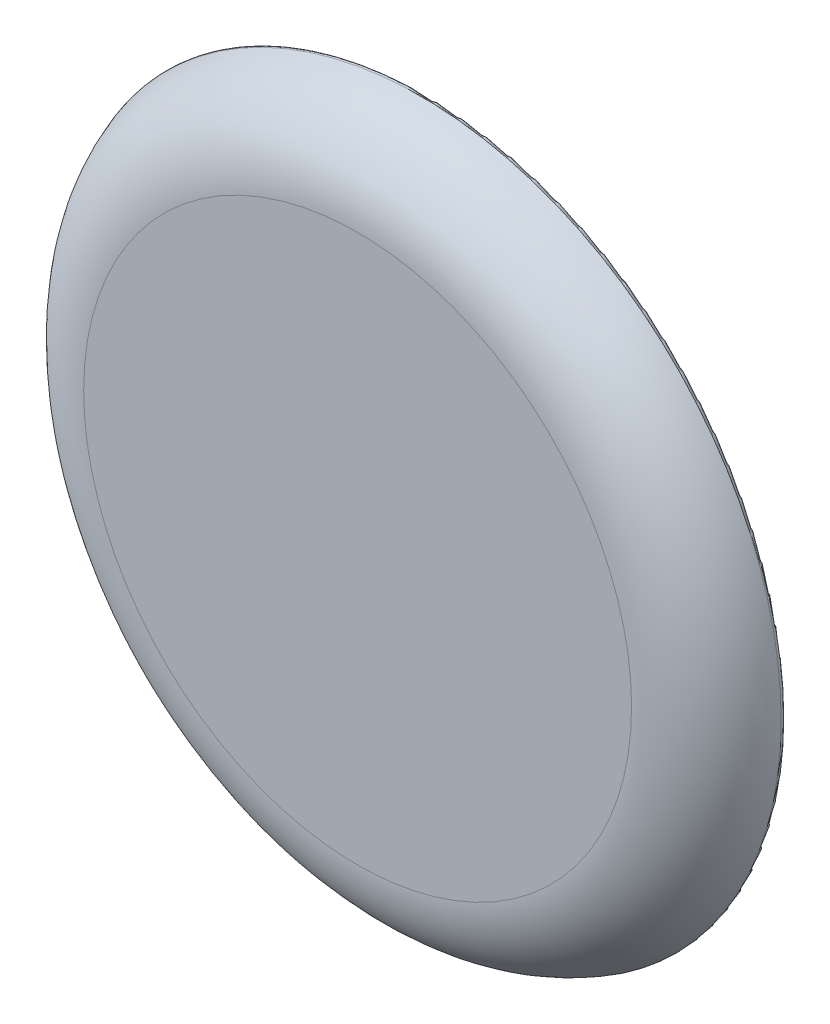
ISO-10303-21;
HEADER;
FILE_DESCRIPTION(('STEP AP214'),'2;1');
FILE_NAME('part.step','',(''),(''),'','','');
FILE_SCHEMA(('AUTOMOTIVE_DESIGN { 1 0 10303 214 1 1 1 1 }'));
ENDSEC;
DATA;
#1=APPLICATION_CONTEXT('core data for automotive mechanical design processes');
#2=APPLICATION_PROTOCOL_DEFINITION('international standard','automotive_design',2000,#1);
#3=PRODUCT_CONTEXT('',#1,'mechanical');
#4=PRODUCT('Part','Part','',(#3));
#5=PRODUCT_RELATED_PRODUCT_CATEGORY('part','',(#4));
#6=PRODUCT_DEFINITION_FORMATION('','',#4);
#7=PRODUCT_DEFINITION_CONTEXT('part definition',#1,'design');
#8=PRODUCT_DEFINITION('design','',#6,#7);
#9=PRODUCT_DEFINITION_SHAPE('','',#8);
#10=(LENGTH_UNIT() NAMED_UNIT(*) SI_UNIT(.MILLI.,.METRE.));
#11=(NAMED_UNIT(*) PLANE_ANGLE_UNIT() SI_UNIT($,.RADIAN.));
#12=(NAMED_UNIT(*) SI_UNIT($,.STERADIAN.) SOLID_ANGLE_UNIT());
#13=UNCERTAINTY_MEASURE_WITH_UNIT(LENGTH_MEASURE(1.E-05),#10,'distance_accuracy_value','');
#14=(GEOMETRIC_REPRESENTATION_CONTEXT(3) GLOBAL_UNCERTAINTY_ASSIGNED_CONTEXT((#13)) GLOBAL_UNIT_ASSIGNED_CONTEXT((#10,
#11,#12)) REPRESENTATION_CONTEXT('',''));
#15=CARTESIAN_POINT('',(0.,0.,0.));
#16=DIRECTION('',(0.,0.,1.));
#17=DIRECTION('',(1.,0.,0.));
#18=AXIS2_PLACEMENT_3D('',#15,#16,#17);
#19=CARTESIAN_POINT('',(-86.2646693199202,57.4705089523402,3.));
#20=DIRECTION('',(0.,0.,1.));
#21=DIRECTION('',(1.,0.,0.));
#22=AXIS2_PLACEMENT_3D('',#19,#20,#21);
#23=PLANE('',#22);
#24=CARTESIAN_POINT('',(-86.2646693199202,57.4705089523402,3.));
#25=DIRECTION('',(0.,0.,1.));
#26=DIRECTION('',(1.,0.,0.));
#27=AXIS2_PLACEMENT_3D('',#24,#25,#26);
#28=CIRCLE('',#27,12.1270166537926);
#29=CARTESIAN_POINT('',(-74.1376526661277,57.4705089523402,3.));
#30=VERTEX_POINT('',#29);
#31=EDGE_CURVE('E64',#30,#30,#28,.T.);
#32=ORIENTED_EDGE('',*,*,#31,.T.);
#33=EDGE_LOOP('',(#32));
#34=FACE_BOUND('',#33,.T.);
#35=ADVANCED_FACE('F41',(#34),#23,.T.);
#36=CARTESIAN_POINT('',(-86.2646693199202,57.4705089523402,0.));
#37=DIRECTION('',(0.,0.,1.));
#38=DIRECTION('',(1.,0.,0.));
#39=AXIS2_PLACEMENT_3D('',#36,#37,#38);
#40=PLANE('',#39);
#41=CARTESIAN_POINT('',(-86.2646693199202,57.4705089523402,0.));
#42=DIRECTION('',(0.,0.,1.));
#43=DIRECTION('',(1.,0.,0.));
#44=AXIS2_PLACEMENT_3D('',#41,#42,#43);
#45=CIRCLE('',#44,11.05);
#46=CARTESIAN_POINT('',(-75.2146693199202,57.4705089523402,0.));
#47=VERTEX_POINT('',#46);
#48=EDGE_CURVE('E52',#47,#47,#45,.F.);
#49=ORIENTED_EDGE('',*,*,#48,.F.);
#50=EDGE_LOOP('',(#49));
#51=FACE_BOUND('',#50,.T.);
#52=CARTESIAN_POINT('',(-86.2646693199202,57.4705089523402,0.));
#53=DIRECTION('',(0.,0.,1.));
#54=DIRECTION('',(1.,0.,0.));
#55=AXIS2_PLACEMENT_3D('',#52,#53,#54);
#56=CIRCLE('',#55,15.8012512679673);
#57=CARTESIAN_POINT('',(-70.4634180519529,57.4705089523402,0.));
#58=VERTEX_POINT('',#57);
#59=EDGE_CURVE('E56',#58,#58,#56,.F.);
#60=ORIENTED_EDGE('',*,*,#59,.T.);
#61=EDGE_LOOP('',(#60));
#62=FACE_BOUND('',#61,.T.);
#63=ADVANCED_FACE('F91',(#51,#62),#40,.F.);
#64=CARTESIAN_POINT('',(-86.2646693199202,57.4705089523402,-1.));
#65=DIRECTION('',(0.,0.,-1.));
#66=DIRECTION('',(-1.,0.,0.));
#67=AXIS2_PLACEMENT_3D('',#64,#65,#66);
#68=TOROIDAL_SURFACE('',#67,12.1270166537926,4.);
#69=CARTESIAN_POINT('',(-86.2646693199202,57.4705089523402,0.194805194805193));
#70=DIRECTION('',(0.,0.,-1.));
#71=DIRECTION('',(-1.,0.,0.));
#72=AXIS2_PLACEMENT_3D('',#69,#70,#71);
#73=CIRCLE('',#72,15.9444032659222);
#74=CARTESIAN_POINT('',(-102.209072585842,57.4705089523402,0.194805194805193));
#75=VERTEX_POINT('',#74);
#76=EDGE_CURVE('E61',#75,#75,#73,.F.);
#77=ORIENTED_EDGE('',*,*,#76,.T.);
#78=EDGE_LOOP('',(#77));
#79=FACE_BOUND('',#78,.T.);
#80=ORIENTED_EDGE('',*,*,#31,.F.);
#81=EDGE_LOOP('',(#80));
#82=FACE_BOUND('',#81,.T.);
#83=ADVANCED_FACE('F87',(#79,#82),#68,.T.);
#84=CARTESIAN_POINT('',(-86.2646693199202,57.4705089523402,0.15));
#85=DIRECTION('',(0.,0.,1.));
#86=DIRECTION('',(1.,0.,0.));
#87=AXIS2_PLACEMENT_3D('',#84,#85,#86);
#88=TOROIDAL_SURFACE('',#87,15.8012512679673,0.15);
#89=ORIENTED_EDGE('',*,*,#59,.F.);
#90=EDGE_LOOP('',(#89));
#91=FACE_BOUND('',#90,.T.);
#92=ORIENTED_EDGE('',*,*,#76,.F.);
#93=EDGE_LOOP('',(#92));
#94=FACE_BOUND('',#93,.T.);
#95=ADVANCED_FACE('F80',(#91,#94),#88,.T.);
#96=CARTESIAN_POINT('',(-86.2646693199202,57.4705089523402,-2.));
#97=DIRECTION('',(0.,0.,-1.));
#98=DIRECTION('',(-1.,0.,0.));
#99=AXIS2_PLACEMENT_3D('',#96,#97,#98);
#100=PLANE('',#99);
#101=CARTESIAN_POINT('',(-86.2646693199202,57.4705089523402,-2.));
#102=DIRECTION('',(0.,0.,-1.));
#103=DIRECTION('',(-1.,0.,0.));
#104=AXIS2_PLACEMENT_3D('',#101,#102,#103);
#105=CIRCLE('',#104,10.8);
#106=CARTESIAN_POINT('',(-97.0646693199203,57.4705089523402,-2.));
#107=VERTEX_POINT('',#106);
#108=EDGE_CURVE('E48',#107,#107,#105,.T.);
#109=ORIENTED_EDGE('',*,*,#108,.T.);
#110=EDGE_LOOP('',(#109));
#111=FACE_BOUND('',#110,.T.);
#112=CARTESIAN_POINT('',(-86.2646693199202,57.4705089523402,-2.));
#113=DIRECTION('',(0.,0.,-1.));
#114=DIRECTION('',(-1.,0.,0.));
#115=AXIS2_PLACEMENT_3D('',#112,#113,#114);
#116=CIRCLE('',#115,7.75000000000001);
#117=CARTESIAN_POINT('',(-94.0146693199203,57.4705089523402,-2.));
#118=VERTEX_POINT('',#117);
#119=EDGE_CURVE('E67',#118,#118,#116,.T.);
#120=ORIENTED_EDGE('',*,*,#119,.F.);
#121=EDGE_LOOP('',(#120));
#122=FACE_BOUND('',#121,.T.);
#123=ADVANCED_FACE('F77',(#111,#122),#100,.T.);
#124=CARTESIAN_POINT('',(-86.2646693199202,57.4705089523402,-2.));
#125=DIRECTION('',(0.,0.,1.));
#126=DIRECTION('',(1.,0.,0.));
#127=AXIS2_PLACEMENT_3D('',#124,#125,#126);
#128=CYLINDRICAL_SURFACE('',#127,11.05);
#129=CARTESIAN_POINT('',(-86.2646693199202,57.4705089523402,-1.75));
#130=DIRECTION('',(0.,0.,-1.));
#131=DIRECTION('',(-1.,0.,0.));
#132=AXIS2_PLACEMENT_3D('',#129,#130,#131);
#133=CIRCLE('',#132,11.05);
#134=CARTESIAN_POINT('',(-97.3146693199203,57.4705089523402,-1.75));
#135=VERTEX_POINT('',#134);
#136=EDGE_CURVE('E10',#135,#135,#133,.F.);
#137=ORIENTED_EDGE('',*,*,#136,.T.);
#138=EDGE_LOOP('',(#137));
#139=FACE_BOUND('',#138,.T.);
#140=ORIENTED_EDGE('',*,*,#48,.T.);
#141=EDGE_LOOP('',(#140));
#142=FACE_BOUND('',#141,.T.);
#143=ADVANCED_FACE('F79',(#139,#142),#128,.T.);
#144=CARTESIAN_POINT('',(-86.2646693199202,57.4705089523402,-2.));
#145=DIRECTION('',(0.,0.,1.));
#146=DIRECTION('',(1.,0.,0.));
#147=AXIS2_PLACEMENT_3D('',#144,#145,#146);
#148=CYLINDRICAL_SURFACE('',#147,7.75000000000001);
#149=ORIENTED_EDGE('',*,*,#119,.T.);
#150=EDGE_LOOP('',(#149));
#151=FACE_BOUND('',#150,.T.);
#152=CARTESIAN_POINT('',(-86.2646693199202,57.4705089523402,0.));
#153=DIRECTION('',(0.,0.,-1.));
#154=DIRECTION('',(-1.,0.,0.));
#155=AXIS2_PLACEMENT_3D('',#152,#153,#154);
#156=CIRCLE('',#155,7.75000000000001);
#157=CARTESIAN_POINT('',(-94.0146693199203,57.4705089523402,0.));
#158=VERTEX_POINT('',#157);
#159=EDGE_CURVE('E68',#158,#158,#156,.T.);
#160=ORIENTED_EDGE('',*,*,#159,.F.);
#161=EDGE_LOOP('',(#160));
#162=FACE_BOUND('',#161,.T.);
#163=ADVANCED_FACE('F74',(#151,#162),#148,.F.);
#164=ORIENTED_EDGE('',*,*,#159,.T.);
#165=EDGE_LOOP('',(#164));
#166=FACE_BOUND('',#165,.T.);
#167=ADVANCED_FACE('F99',(#166),#40,.F.);
#168=CARTESIAN_POINT('',(-86.2646693199202,57.4705089523402,-1.75));
#169=DIRECTION('',(0.,0.,-1.));
#170=DIRECTION('',(-1.,0.,0.));
#171=AXIS2_PLACEMENT_3D('',#168,#169,#170);
#172=TOROIDAL_SURFACE('',#171,10.8,0.25);
#173=ORIENTED_EDGE('',*,*,#136,.F.);
#174=EDGE_LOOP('',(#173));
#175=FACE_BOUND('',#174,.T.);
#176=ORIENTED_EDGE('',*,*,#108,.F.);
#177=EDGE_LOOP('',(#176));
#178=FACE_BOUND('',#177,.T.);
#179=ADVANCED_FACE('F43',(#175,#178),#172,.T.);
#180=CLOSED_SHELL('',(#35,#63,#83,#95,#123,#143,#163,#167,#179));
#181=MANIFOLD_SOLID_BREP('B2',#180);
#182=ADVANCED_BREP_SHAPE_REPRESENTATION('',(#18,#181),#14);
#183=SHAPE_DEFINITION_REPRESENTATION(#9,#182);
ENDSEC;
END-ISO-10303-21;
